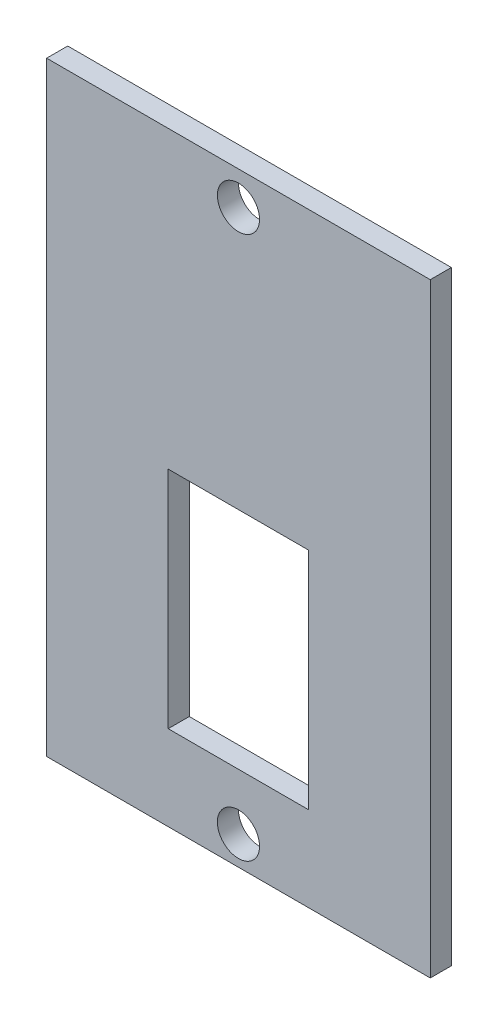
ISO-10303-21;
HEADER;
FILE_DESCRIPTION(('STEP AP214'),'2;1');
FILE_NAME('part.step','',(''),(''),'','','');
FILE_SCHEMA(('AUTOMOTIVE_DESIGN { 1 0 10303 214 1 1 1 1 }'));
ENDSEC;
DATA;
#1=APPLICATION_CONTEXT('core data for automotive mechanical design processes');
#2=APPLICATION_PROTOCOL_DEFINITION('international standard','automotive_design',2000,#1);
#3=PRODUCT_CONTEXT('',#1,'mechanical');
#4=PRODUCT('Part','Part','',(#3));
#5=PRODUCT_RELATED_PRODUCT_CATEGORY('part','',(#4));
#6=PRODUCT_DEFINITION_FORMATION('','',#4);
#7=PRODUCT_DEFINITION_CONTEXT('part definition',#1,'design');
#8=PRODUCT_DEFINITION('design','',#6,#7);
#9=PRODUCT_DEFINITION_SHAPE('','',#8);
#10=(LENGTH_UNIT() NAMED_UNIT(*) SI_UNIT(.MILLI.,.METRE.));
#11=(NAMED_UNIT(*) PLANE_ANGLE_UNIT() SI_UNIT($,.RADIAN.));
#12=(NAMED_UNIT(*) SI_UNIT($,.STERADIAN.) SOLID_ANGLE_UNIT());
#13=UNCERTAINTY_MEASURE_WITH_UNIT(LENGTH_MEASURE(1.E-05),#10,'distance_accuracy_value','');
#14=(GEOMETRIC_REPRESENTATION_CONTEXT(3) GLOBAL_UNCERTAINTY_ASSIGNED_CONTEXT((#13)) GLOBAL_UNIT_ASSIGNED_CONTEXT((#10,
#11,#12)) REPRESENTATION_CONTEXT('',''));
#15=CARTESIAN_POINT('',(0.,0.,0.));
#16=DIRECTION('',(0.,0.,1.));
#17=DIRECTION('',(1.,0.,0.));
#18=AXIS2_PLACEMENT_3D('',#15,#16,#17);
#19=CARTESIAN_POINT('',(-5.,0.,1.5));
#20=DIRECTION('',(1.,0.,0.));
#21=DIRECTION('',(0.,0.,-1.));
#22=AXIS2_PLACEMENT_3D('',#19,#20,#21);
#23=PLANE('',#22);
#24=DIRECTION('',(0.,-1.,0.));
#25=VECTOR('',#24,1.);
#26=CARTESIAN_POINT('',(-5.,0.,0.));
#27=LINE('',#26,#25);
#28=CARTESIAN_POINT('',(-5.,7.43988451525132,0.));
#29=VERTEX_POINT('',#28);
#30=CARTESIAN_POINT('',(-5.,-8.56011548474868,0.));
#31=VERTEX_POINT('',#30);
#32=EDGE_CURVE('E155',#29,#31,#27,.T.);
#33=ORIENTED_EDGE('',*,*,#32,.F.);
#34=DIRECTION('',(0.,0.,-1.));
#35=VECTOR('',#34,1.);
#36=CARTESIAN_POINT('',(-5.,7.43988451525132,1.5));
#37=LINE('',#36,#35);
#38=CARTESIAN_POINT('',(-5.,7.43988451525132,1.5));
#39=VERTEX_POINT('',#38);
#40=EDGE_CURVE('E11',#39,#29,#37,.T.);
#41=ORIENTED_EDGE('',*,*,#40,.F.);
#42=DIRECTION('',(0.,-1.,0.));
#43=VECTOR('',#42,1.);
#44=CARTESIAN_POINT('',(-5.,0.,1.5));
#45=LINE('',#44,#43);
#46=CARTESIAN_POINT('',(-5.,-8.56011548474868,1.5));
#47=VERTEX_POINT('',#46);
#48=EDGE_CURVE('E131',#39,#47,#45,.T.);
#49=ORIENTED_EDGE('',*,*,#48,.T.);
#50=DIRECTION('',(0.,0.,-1.));
#51=VECTOR('',#50,1.);
#52=CARTESIAN_POINT('',(-5.,-8.56011548474868,1.5));
#53=LINE('',#52,#51);
#54=EDGE_CURVE('E96',#47,#31,#53,.T.);
#55=ORIENTED_EDGE('',*,*,#54,.T.);
#56=EDGE_LOOP('',(#33,#41,#49,#55));
#57=FACE_BOUND('',#56,.T.);
#58=ADVANCED_FACE('F43',(#57),#23,.T.);
#59=CARTESIAN_POINT('',(0.,7.43988451525132,1.5));
#60=DIRECTION('',(0.,-1.,0.));
#61=DIRECTION('',(0.,0.,-1.));
#62=AXIS2_PLACEMENT_3D('',#59,#60,#61);
#63=PLANE('',#62);
#64=DIRECTION('',(-1.,0.,0.));
#65=VECTOR('',#64,1.);
#66=CARTESIAN_POINT('',(0.,7.43988451525132,0.));
#67=LINE('',#66,#65);
#68=CARTESIAN_POINT('',(5.,7.43988451525132,0.));
#69=VERTEX_POINT('',#68);
#70=EDGE_CURVE('E123',#69,#29,#67,.T.);
#71=ORIENTED_EDGE('',*,*,#70,.F.);
#72=DIRECTION('',(0.,0.,-1.));
#73=VECTOR('',#72,1.);
#74=CARTESIAN_POINT('',(5.,7.43988451525132,1.5));
#75=LINE('',#74,#73);
#76=CARTESIAN_POINT('',(5.,7.43988451525132,1.5));
#77=VERTEX_POINT('',#76);
#78=EDGE_CURVE('E53',#77,#69,#75,.T.);
#79=ORIENTED_EDGE('',*,*,#78,.F.);
#80=DIRECTION('',(-1.,0.,0.));
#81=VECTOR('',#80,1.);
#82=CARTESIAN_POINT('',(0.,7.43988451525132,1.5));
#83=LINE('',#82,#81);
#84=EDGE_CURVE('E121',#77,#39,#83,.T.);
#85=ORIENTED_EDGE('',*,*,#84,.T.);
#86=ORIENTED_EDGE('',*,*,#40,.T.);
#87=EDGE_LOOP('',(#71,#79,#85,#86));
#88=FACE_BOUND('',#87,.T.);
#89=ADVANCED_FACE('F120',(#88),#63,.T.);
#90=CARTESIAN_POINT('',(5.,0.,1.5));
#91=DIRECTION('',(-1.,0.,0.));
#92=DIRECTION('',(0.,0.,1.));
#93=AXIS2_PLACEMENT_3D('',#90,#91,#92);
#94=PLANE('',#93);
#95=DIRECTION('',(0.,1.,0.));
#96=VECTOR('',#95,1.);
#97=CARTESIAN_POINT('',(5.,0.,0.));
#98=LINE('',#97,#96);
#99=CARTESIAN_POINT('',(5.,-8.56011548474868,0.));
#100=VERTEX_POINT('',#99);
#101=EDGE_CURVE('E159',#100,#69,#98,.T.);
#102=ORIENTED_EDGE('',*,*,#101,.F.);
#103=DIRECTION('',(0.,0.,-1.));
#104=VECTOR('',#103,1.);
#105=CARTESIAN_POINT('',(5.,-8.56011548474868,1.5));
#106=LINE('',#105,#104);
#107=CARTESIAN_POINT('',(5.,-8.56011548474868,1.5));
#108=VERTEX_POINT('',#107);
#109=EDGE_CURVE('E89',#108,#100,#106,.T.);
#110=ORIENTED_EDGE('',*,*,#109,.F.);
#111=DIRECTION('',(0.,1.,0.));
#112=VECTOR('',#111,1.);
#113=CARTESIAN_POINT('',(5.,0.,1.5));
#114=LINE('',#113,#112);
#115=EDGE_CURVE('E130',#108,#77,#114,.T.);
#116=ORIENTED_EDGE('',*,*,#115,.T.);
#117=ORIENTED_EDGE('',*,*,#78,.T.);
#118=EDGE_LOOP('',(#102,#110,#116,#117));
#119=FACE_BOUND('',#118,.T.);
#120=ADVANCED_FACE('F133',(#119),#94,.T.);
#121=CARTESIAN_POINT('',(13.65,0.,1.5));
#122=DIRECTION('',(1.,0.,0.));
#123=DIRECTION('',(0.,1.,0.));
#124=AXIS2_PLACEMENT_3D('',#121,#122,#123);
#125=PLANE('',#124);
#126=DIRECTION('',(0.,-1.,0.));
#127=VECTOR('',#126,1.);
#128=CARTESIAN_POINT('',(13.65,0.,0.));
#129=LINE('',#128,#127);
#130=CARTESIAN_POINT('',(13.65,28.4398845152513,0.));
#131=VERTEX_POINT('',#130);
#132=CARTESIAN_POINT('',(13.65,-14.6,0.));
#133=VERTEX_POINT('',#132);
#134=EDGE_CURVE('E142',#131,#133,#129,.T.);
#135=ORIENTED_EDGE('',*,*,#134,.F.);
#136=DIRECTION('',(0.,0.,-1.));
#137=VECTOR('',#136,1.);
#138=CARTESIAN_POINT('',(13.65,28.4398845152513,1.5));
#139=LINE('',#138,#137);
#140=CARTESIAN_POINT('',(13.65,28.4398845152513,1.5));
#141=VERTEX_POINT('',#140);
#142=EDGE_CURVE('E47',#141,#131,#139,.T.);
#143=ORIENTED_EDGE('',*,*,#142,.F.);
#144=DIRECTION('',(0.,-1.,0.));
#145=VECTOR('',#144,1.);
#146=CARTESIAN_POINT('',(13.65,0.,1.5));
#147=LINE('',#146,#145);
#148=CARTESIAN_POINT('',(13.65,-14.6,1.5));
#149=VERTEX_POINT('',#148);
#150=EDGE_CURVE('E194',#141,#149,#147,.T.);
#151=ORIENTED_EDGE('',*,*,#150,.T.);
#152=DIRECTION('',(0.,0.,-1.));
#153=VECTOR('',#152,1.);
#154=CARTESIAN_POINT('',(13.65,-14.6,1.5));
#155=LINE('',#154,#153);
#156=EDGE_CURVE('E135',#149,#133,#155,.T.);
#157=ORIENTED_EDGE('',*,*,#156,.T.);
#158=EDGE_LOOP('',(#135,#143,#151,#157));
#159=FACE_BOUND('',#158,.T.);
#160=ADVANCED_FACE('F178',(#159),#125,.T.);
#161=CARTESIAN_POINT('',(0.,28.4398845152513,1.5));
#162=DIRECTION('',(0.,1.,0.));
#163=DIRECTION('',(-1.,0.,0.));
#164=AXIS2_PLACEMENT_3D('',#161,#162,#163);
#165=PLANE('',#164);
#166=DIRECTION('',(1.,0.,0.));
#167=VECTOR('',#166,1.);
#168=CARTESIAN_POINT('',(0.,28.4398845152513,0.));
#169=LINE('',#168,#167);
#170=CARTESIAN_POINT('',(-13.65,28.4398845152513,0.));
#171=VERTEX_POINT('',#170);
#172=EDGE_CURVE('E146',#171,#131,#169,.T.);
#173=ORIENTED_EDGE('',*,*,#172,.F.);
#174=DIRECTION('',(0.,0.,-1.));
#175=VECTOR('',#174,1.);
#176=CARTESIAN_POINT('',(-13.65,28.4398845152513,1.5));
#177=LINE('',#176,#175);
#178=CARTESIAN_POINT('',(-13.65,28.4398845152513,1.5));
#179=VERTEX_POINT('',#178);
#180=EDGE_CURVE('E168',#179,#171,#177,.T.);
#181=ORIENTED_EDGE('',*,*,#180,.F.);
#182=DIRECTION('',(1.,0.,0.));
#183=VECTOR('',#182,1.);
#184=CARTESIAN_POINT('',(0.,28.4398845152513,1.5));
#185=LINE('',#184,#183);
#186=EDGE_CURVE('E177',#179,#141,#185,.T.);
#187=ORIENTED_EDGE('',*,*,#186,.T.);
#188=ORIENTED_EDGE('',*,*,#142,.T.);
#189=EDGE_LOOP('',(#173,#181,#187,#188));
#190=FACE_BOUND('',#189,.T.);
#191=ADVANCED_FACE('F175',(#190),#165,.T.);
#192=CARTESIAN_POINT('',(-13.65,0.,1.5));
#193=DIRECTION('',(-1.,0.,0.));
#194=DIRECTION('',(0.,-1.,0.));
#195=AXIS2_PLACEMENT_3D('',#192,#193,#194);
#196=PLANE('',#195);
#197=DIRECTION('',(0.,1.,0.));
#198=VECTOR('',#197,1.);
#199=CARTESIAN_POINT('',(-13.65,0.,0.));
#200=LINE('',#199,#198);
#201=CARTESIAN_POINT('',(-13.65,-14.6,0.));
#202=VERTEX_POINT('',#201);
#203=EDGE_CURVE('E149',#202,#171,#200,.T.);
#204=ORIENTED_EDGE('',*,*,#203,.F.);
#205=DIRECTION('',(0.,0.,-1.));
#206=VECTOR('',#205,1.);
#207=CARTESIAN_POINT('',(-13.65,-14.6,1.5));
#208=LINE('',#207,#206);
#209=CARTESIAN_POINT('',(-13.65,-14.6,1.5));
#210=VERTEX_POINT('',#209);
#211=EDGE_CURVE('E167',#210,#202,#208,.T.);
#212=ORIENTED_EDGE('',*,*,#211,.F.);
#213=DIRECTION('',(0.,1.,0.));
#214=VECTOR('',#213,1.);
#215=CARTESIAN_POINT('',(-13.65,0.,1.5));
#216=LINE('',#215,#214);
#217=EDGE_CURVE('E187',#210,#179,#216,.T.);
#218=ORIENTED_EDGE('',*,*,#217,.T.);
#219=ORIENTED_EDGE('',*,*,#180,.T.);
#220=EDGE_LOOP('',(#204,#212,#218,#219));
#221=FACE_BOUND('',#220,.T.);
#222=ADVANCED_FACE('F184',(#221),#196,.T.);
#223=CARTESIAN_POINT('',(0.,-14.6,1.5));
#224=DIRECTION('',(0.,1.,0.));
#225=DIRECTION('',(0.,0.,1.));
#226=AXIS2_PLACEMENT_3D('',#223,#224,#225);
#227=PLANE('',#226);
#228=DIRECTION('',(1.,0.,0.));
#229=VECTOR('',#228,1.);
#230=CARTESIAN_POINT('',(0.,-14.6,0.));
#231=LINE('',#230,#229);
#232=EDGE_CURVE('E152',#202,#133,#231,.T.);
#233=ORIENTED_EDGE('',*,*,#232,.T.);
#234=ORIENTED_EDGE('',*,*,#156,.F.);
#235=DIRECTION('',(1.,0.,0.));
#236=VECTOR('',#235,1.);
#237=CARTESIAN_POINT('',(0.,-14.6,1.5));
#238=LINE('',#237,#236);
#239=EDGE_CURVE('E189',#210,#149,#238,.T.);
#240=ORIENTED_EDGE('',*,*,#239,.F.);
#241=ORIENTED_EDGE('',*,*,#211,.T.);
#242=EDGE_LOOP('',(#233,#234,#240,#241));
#243=FACE_BOUND('',#242,.T.);
#244=ADVANCED_FACE('F190',(#243),#227,.F.);
#245=CARTESIAN_POINT('',(0.,-12.5601154847487,1.5));
#246=DIRECTION('',(0.,0.,-1.));
#247=DIRECTION('',(-1.,0.,0.));
#248=AXIS2_PLACEMENT_3D('',#245,#246,#247);
#249=CYLINDRICAL_SURFACE('',#248,1.5);
#250=CARTESIAN_POINT('',(0.,-12.5601154847487,1.5));
#251=DIRECTION('',(0.,0.,1.));
#252=DIRECTION('',(1.,0.,0.));
#253=AXIS2_PLACEMENT_3D('',#250,#251,#252);
#254=CIRCLE('',#253,1.5);
#255=CARTESIAN_POINT('',(1.5,-12.5601154847487,1.5));
#256=VERTEX_POINT('',#255);
#257=EDGE_CURVE('E163',#256,#256,#254,.T.);
#258=ORIENTED_EDGE('',*,*,#257,.T.);
#259=EDGE_LOOP('',(#258));
#260=FACE_BOUND('',#259,.T.);
#261=CARTESIAN_POINT('',(0.,-12.5601154847487,0.));
#262=DIRECTION('',(0.,0.,1.));
#263=DIRECTION('',(1.,0.,0.));
#264=AXIS2_PLACEMENT_3D('',#261,#262,#263);
#265=CIRCLE('',#264,1.5);
#266=CARTESIAN_POINT('',(1.5,-12.5601154847487,0.));
#267=VERTEX_POINT('',#266);
#268=EDGE_CURVE('E139',#267,#267,#265,.T.);
#269=ORIENTED_EDGE('',*,*,#268,.F.);
#270=EDGE_LOOP('',(#269));
#271=FACE_BOUND('',#270,.T.);
#272=ADVANCED_FACE('F45',(#260,#271),#249,.F.);
#273=CARTESIAN_POINT('',(0.,-8.56011548474868,1.5));
#274=DIRECTION('',(0.,-1.,0.));
#275=DIRECTION('',(0.,0.,-1.));
#276=AXIS2_PLACEMENT_3D('',#273,#274,#275);
#277=PLANE('',#276);
#278=DIRECTION('',(-1.,0.,0.));
#279=VECTOR('',#278,1.);
#280=CARTESIAN_POINT('',(0.,-8.56011548474868,0.));
#281=LINE('',#280,#279);
#282=EDGE_CURVE('E161',#100,#31,#281,.T.);
#283=ORIENTED_EDGE('',*,*,#282,.T.);
#284=ORIENTED_EDGE('',*,*,#54,.F.);
#285=DIRECTION('',(-1.,0.,0.));
#286=VECTOR('',#285,1.);
#287=CARTESIAN_POINT('',(0.,-8.56011548474868,1.5));
#288=LINE('',#287,#286);
#289=EDGE_CURVE('E62',#108,#47,#288,.T.);
#290=ORIENTED_EDGE('',*,*,#289,.F.);
#291=ORIENTED_EDGE('',*,*,#109,.T.);
#292=EDGE_LOOP('',(#283,#284,#290,#291));
#293=FACE_BOUND('',#292,.T.);
#294=ADVANCED_FACE('F197',(#293),#277,.F.);
#295=CARTESIAN_POINT('',(0.,0.,1.5));
#296=DIRECTION('',(0.,0.,1.));
#297=DIRECTION('',(1.,0.,0.));
#298=AXIS2_PLACEMENT_3D('',#295,#296,#297);
#299=PLANE('',#298);
#300=CARTESIAN_POINT('',(0.,26.0685372019023,1.5));
#301=DIRECTION('',(0.,0.,1.));
#302=DIRECTION('',(1.,0.,0.));
#303=AXIS2_PLACEMENT_3D('',#300,#301,#302);
#304=CIRCLE('',#303,1.5);
#305=CARTESIAN_POINT('',(1.5,26.0685372019023,1.5));
#306=VERTEX_POINT('',#305);
#307=EDGE_CURVE('E143',#306,#306,#304,.T.);
#308=ORIENTED_EDGE('',*,*,#307,.F.);
#309=EDGE_LOOP('',(#308));
#310=FACE_BOUND('',#309,.T.);
#311=ORIENTED_EDGE('',*,*,#257,.F.);
#312=EDGE_LOOP('',(#311));
#313=FACE_BOUND('',#312,.T.);
#314=ORIENTED_EDGE('',*,*,#150,.F.);
#315=ORIENTED_EDGE('',*,*,#186,.F.);
#316=ORIENTED_EDGE('',*,*,#217,.F.);
#317=ORIENTED_EDGE('',*,*,#239,.T.);
#318=EDGE_LOOP('',(#314,#315,#316,#317));
#319=FACE_BOUND('',#318,.T.);
#320=ORIENTED_EDGE('',*,*,#48,.F.);
#321=ORIENTED_EDGE('',*,*,#84,.F.);
#322=ORIENTED_EDGE('',*,*,#115,.F.);
#323=ORIENTED_EDGE('',*,*,#289,.T.);
#324=EDGE_LOOP('',(#320,#321,#322,#323));
#325=FACE_BOUND('',#324,.T.);
#326=ADVANCED_FACE('F129',(#310,#313,#319,#325),#299,.T.);
#327=CARTESIAN_POINT('',(0.,0.,0.));
#328=DIRECTION('',(0.,0.,1.));
#329=DIRECTION('',(1.,0.,0.));
#330=AXIS2_PLACEMENT_3D('',#327,#328,#329);
#331=PLANE('',#330);
#332=CARTESIAN_POINT('',(0.,26.0685372019023,0.));
#333=DIRECTION('',(0.,0.,-1.));
#334=DIRECTION('',(-1.,0.,0.));
#335=AXIS2_PLACEMENT_3D('',#332,#333,#334);
#336=CIRCLE('',#335,1.5);
#337=CARTESIAN_POINT('',(-1.5,26.0685372019023,0.));
#338=VERTEX_POINT('',#337);
#339=EDGE_CURVE('E307',#338,#338,#336,.T.);
#340=ORIENTED_EDGE('',*,*,#339,.F.);
#341=EDGE_LOOP('',(#340));
#342=FACE_BOUND('',#341,.T.);
#343=ORIENTED_EDGE('',*,*,#268,.T.);
#344=EDGE_LOOP('',(#343));
#345=FACE_BOUND('',#344,.T.);
#346=ORIENTED_EDGE('',*,*,#134,.T.);
#347=ORIENTED_EDGE('',*,*,#232,.F.);
#348=ORIENTED_EDGE('',*,*,#203,.T.);
#349=ORIENTED_EDGE('',*,*,#172,.T.);
#350=EDGE_LOOP('',(#346,#347,#348,#349));
#351=FACE_BOUND('',#350,.T.);
#352=ORIENTED_EDGE('',*,*,#32,.T.);
#353=ORIENTED_EDGE('',*,*,#282,.F.);
#354=ORIENTED_EDGE('',*,*,#101,.T.);
#355=ORIENTED_EDGE('',*,*,#70,.T.);
#356=EDGE_LOOP('',(#352,#353,#354,#355));
#357=FACE_BOUND('',#356,.T.);
#358=ADVANCED_FACE('F182',(#342,#345,#351,#357),#331,.F.);
#359=CARTESIAN_POINT('',(0.,26.0685372019023,10.));
#360=DIRECTION('',(0.,0.,-1.));
#361=DIRECTION('',(-1.,0.,0.));
#362=AXIS2_PLACEMENT_3D('',#359,#360,#361);
#363=CYLINDRICAL_SURFACE('',#362,1.5);
#364=ORIENTED_EDGE('',*,*,#307,.T.);
#365=EDGE_LOOP('',(#364));
#366=FACE_BOUND('',#365,.T.);
#367=ORIENTED_EDGE('',*,*,#339,.T.);
#368=EDGE_LOOP('',(#367));
#369=FACE_BOUND('',#368,.T.);
#370=ADVANCED_FACE('F283',(#366,#369),#363,.F.);
#371=CLOSED_SHELL('',(#58,#89,#120,#160,#191,#222,#244,#272,#294,#326,#358,#370));
#372=MANIFOLD_SOLID_BREP('B2',#371);
#373=ADVANCED_BREP_SHAPE_REPRESENTATION('',(#18,#372),#14);
#374=SHAPE_DEFINITION_REPRESENTATION(#9,#373);
ENDSEC;
END-ISO-10303-21;
